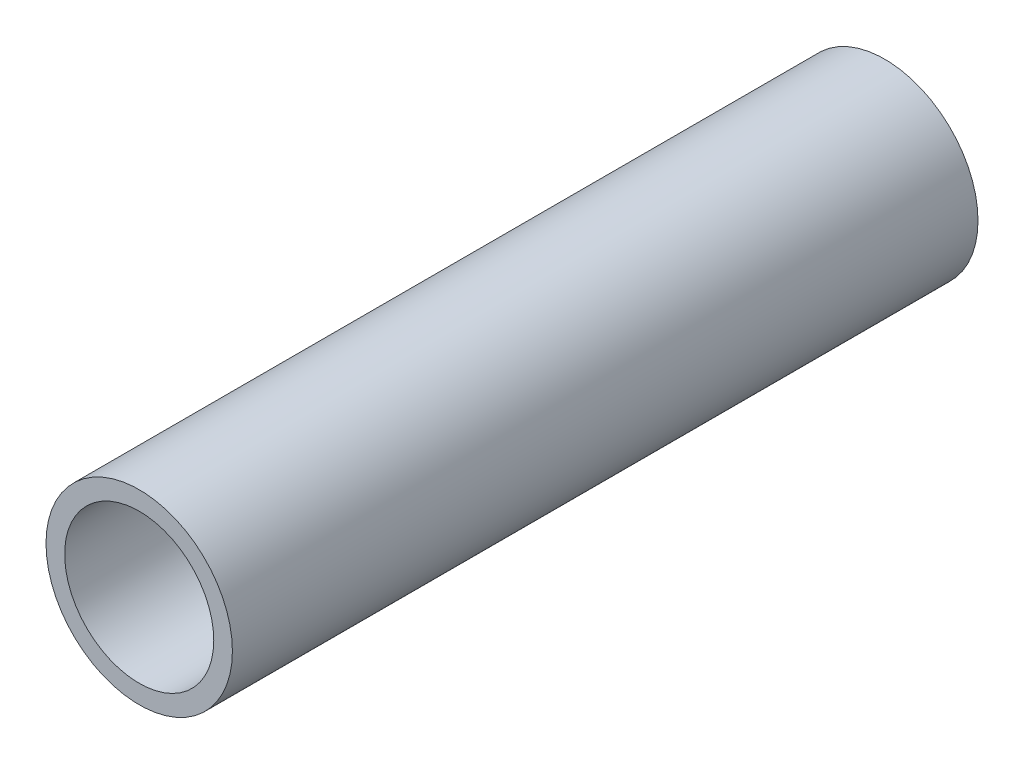
ISO-10303-21;
HEADER;
FILE_DESCRIPTION(('STEP AP214'),'2;1');
FILE_NAME('part.step','',(''),(''),'','','');
FILE_SCHEMA(('AUTOMOTIVE_DESIGN { 1 0 10303 214 1 1 1 1 }'));
ENDSEC;
DATA;
#1=APPLICATION_CONTEXT('core data for automotive mechanical design processes');
#2=APPLICATION_PROTOCOL_DEFINITION('international standard','automotive_design',2000,#1);
#3=PRODUCT_CONTEXT('',#1,'mechanical');
#4=PRODUCT('Part','Part','',(#3));
#5=PRODUCT_RELATED_PRODUCT_CATEGORY('part','',(#4));
#6=PRODUCT_DEFINITION_FORMATION('','',#4);
#7=PRODUCT_DEFINITION_CONTEXT('part definition',#1,'design');
#8=PRODUCT_DEFINITION('design','',#6,#7);
#9=PRODUCT_DEFINITION_SHAPE('','',#8);
#10=(LENGTH_UNIT() NAMED_UNIT(*) SI_UNIT(.MILLI.,.METRE.));
#11=(NAMED_UNIT(*) PLANE_ANGLE_UNIT() SI_UNIT($,.RADIAN.));
#12=(NAMED_UNIT(*) SI_UNIT($,.STERADIAN.) SOLID_ANGLE_UNIT());
#13=UNCERTAINTY_MEASURE_WITH_UNIT(LENGTH_MEASURE(1.E-05),#10,'distance_accuracy_value','');
#14=(GEOMETRIC_REPRESENTATION_CONTEXT(3) GLOBAL_UNCERTAINTY_ASSIGNED_CONTEXT((#13)) GLOBAL_UNIT_ASSIGNED_CONTEXT((#10,
#11,#12)) REPRESENTATION_CONTEXT('',''));
#15=CARTESIAN_POINT('',(0.,0.,0.));
#16=DIRECTION('',(0.,0.,1.));
#17=DIRECTION('',(1.,0.,0.));
#18=AXIS2_PLACEMENT_3D('',#15,#16,#17);
#19=CARTESIAN_POINT('',(0.,0.,40.));
#20=DIRECTION('',(0.,0.,1.));
#21=DIRECTION('',(1.,0.,0.));
#22=AXIS2_PLACEMENT_3D('',#19,#20,#21);
#23=PLANE('',#22);
#24=CARTESIAN_POINT('',(0.,0.,40.));
#25=DIRECTION('',(0.,0.,1.));
#26=DIRECTION('',(1.,0.,0.));
#27=AXIS2_PLACEMENT_3D('',#24,#25,#26);
#28=CIRCLE('',#27,5.);
#29=CARTESIAN_POINT('',(5.,0.,40.));
#30=VERTEX_POINT('',#29);
#31=EDGE_CURVE('E10',#30,#30,#28,.T.);
#32=ORIENTED_EDGE('',*,*,#31,.T.);
#33=EDGE_LOOP('',(#32));
#34=FACE_BOUND('',#33,.T.);
#35=CARTESIAN_POINT('',(0.,0.,40.));
#36=DIRECTION('',(0.,0.,1.));
#37=DIRECTION('',(1.,0.,0.));
#38=AXIS2_PLACEMENT_3D('',#35,#36,#37);
#39=CIRCLE('',#38,4.);
#40=CARTESIAN_POINT('',(4.,0.,40.));
#41=VERTEX_POINT('',#40);
#42=EDGE_CURVE('E47',#41,#41,#39,.T.);
#43=ORIENTED_EDGE('',*,*,#42,.F.);
#44=EDGE_LOOP('',(#43));
#45=FACE_BOUND('',#44,.T.);
#46=ADVANCED_FACE('F36',(#34,#45),#23,.T.);
#47=CARTESIAN_POINT('',(0.,0.,0.));
#48=DIRECTION('',(0.,0.,1.));
#49=DIRECTION('',(1.,0.,0.));
#50=AXIS2_PLACEMENT_3D('',#47,#48,#49);
#51=PLANE('',#50);
#52=CARTESIAN_POINT('',(0.,0.,0.));
#53=DIRECTION('',(0.,0.,1.));
#54=DIRECTION('',(1.,0.,0.));
#55=AXIS2_PLACEMENT_3D('',#52,#53,#54);
#56=CIRCLE('',#55,5.);
#57=CARTESIAN_POINT('',(5.,0.,0.));
#58=VERTEX_POINT('',#57);
#59=EDGE_CURVE('E40',#58,#58,#56,.T.);
#60=ORIENTED_EDGE('',*,*,#59,.F.);
#61=EDGE_LOOP('',(#60));
#62=FACE_BOUND('',#61,.T.);
#63=CARTESIAN_POINT('',(0.,0.,0.));
#64=DIRECTION('',(0.,0.,1.));
#65=DIRECTION('',(1.,0.,0.));
#66=AXIS2_PLACEMENT_3D('',#63,#64,#65);
#67=CIRCLE('',#66,4.);
#68=CARTESIAN_POINT('',(4.,0.,0.));
#69=VERTEX_POINT('',#68);
#70=EDGE_CURVE('E49',#69,#69,#67,.T.);
#71=ORIENTED_EDGE('',*,*,#70,.T.);
#72=EDGE_LOOP('',(#71));
#73=FACE_BOUND('',#72,.T.);
#74=ADVANCED_FACE('F59',(#62,#73),#51,.F.);
#75=CARTESIAN_POINT('',(0.,0.,40.));
#76=DIRECTION('',(0.,0.,-1.));
#77=DIRECTION('',(-1.,0.,0.));
#78=AXIS2_PLACEMENT_3D('',#75,#76,#77);
#79=CYLINDRICAL_SURFACE('',#78,5.);
#80=ORIENTED_EDGE('',*,*,#31,.F.);
#81=EDGE_LOOP('',(#80));
#82=FACE_BOUND('',#81,.T.);
#83=ORIENTED_EDGE('',*,*,#59,.T.);
#84=EDGE_LOOP('',(#83));
#85=FACE_BOUND('',#84,.T.);
#86=ADVANCED_FACE('F38',(#82,#85),#79,.T.);
#87=CARTESIAN_POINT('',(0.,0.,40.));
#88=DIRECTION('',(0.,0.,-1.));
#89=DIRECTION('',(-1.,0.,0.));
#90=AXIS2_PLACEMENT_3D('',#87,#88,#89);
#91=CYLINDRICAL_SURFACE('',#90,4.);
#92=ORIENTED_EDGE('',*,*,#42,.T.);
#93=EDGE_LOOP('',(#92));
#94=FACE_BOUND('',#93,.T.);
#95=ORIENTED_EDGE('',*,*,#70,.F.);
#96=EDGE_LOOP('',(#95));
#97=FACE_BOUND('',#96,.T.);
#98=ADVANCED_FACE('F55',(#94,#97),#91,.F.);
#99=CLOSED_SHELL('',(#46,#74,#86,#98));
#100=MANIFOLD_SOLID_BREP('B2',#99);
#101=ADVANCED_BREP_SHAPE_REPRESENTATION('',(#18,#100),#14);
#102=SHAPE_DEFINITION_REPRESENTATION(#9,#101);
ENDSEC;
END-ISO-10303-21;
